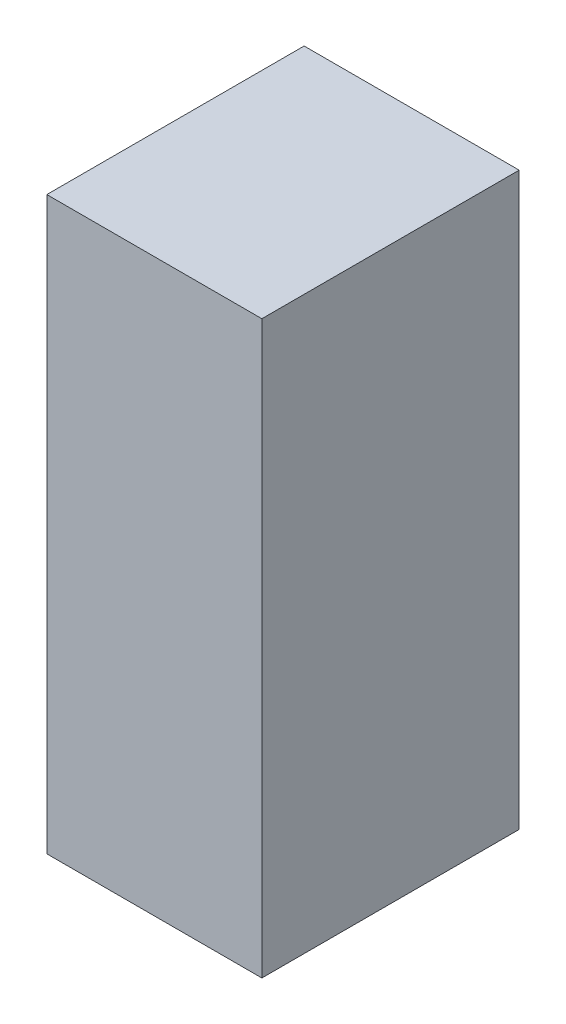
ISO-10303-21;
HEADER;
FILE_DESCRIPTION(('STEP AP214'),'2;1');
FILE_NAME('part.step','',(''),(''),'','','');
FILE_SCHEMA(('AUTOMOTIVE_DESIGN { 1 0 10303 214 1 1 1 1 }'));
ENDSEC;
DATA;
#1=APPLICATION_CONTEXT('core data for automotive mechanical design processes');
#2=APPLICATION_PROTOCOL_DEFINITION('international standard','automotive_design',2000,#1);
#3=PRODUCT_CONTEXT('',#1,'mechanical');
#4=PRODUCT('Part','Part','',(#3));
#5=PRODUCT_RELATED_PRODUCT_CATEGORY('part','',(#4));
#6=PRODUCT_DEFINITION_FORMATION('','',#4);
#7=PRODUCT_DEFINITION_CONTEXT('part definition',#1,'design');
#8=PRODUCT_DEFINITION('design','',#6,#7);
#9=PRODUCT_DEFINITION_SHAPE('','',#8);
#10=(LENGTH_UNIT() NAMED_UNIT(*) SI_UNIT(.MILLI.,.METRE.));
#11=(NAMED_UNIT(*) PLANE_ANGLE_UNIT() SI_UNIT($,.RADIAN.));
#12=(NAMED_UNIT(*) SI_UNIT($,.STERADIAN.) SOLID_ANGLE_UNIT());
#13=UNCERTAINTY_MEASURE_WITH_UNIT(LENGTH_MEASURE(1.E-05),#10,'distance_accuracy_value','');
#14=(GEOMETRIC_REPRESENTATION_CONTEXT(3) GLOBAL_UNCERTAINTY_ASSIGNED_CONTEXT((#13)) GLOBAL_UNIT_ASSIGNED_CONTEXT((#10,
#11,#12)) REPRESENTATION_CONTEXT('',''));
#15=CARTESIAN_POINT('',(0.,0.,0.));
#16=DIRECTION('',(0.,0.,1.));
#17=DIRECTION('',(1.,0.,0.));
#18=AXIS2_PLACEMENT_3D('',#15,#16,#17);
#19=CARTESIAN_POINT('',(0.,77.,0.));
#20=DIRECTION('',(1.,0.,0.));
#21=DIRECTION('',(0.,0.,-1.));
#22=AXIS2_PLACEMENT_3D('',#19,#20,#21);
#23=PLANE('',#22);
#24=DIRECTION('',(0.,0.,1.));
#25=VECTOR('',#24,1.);
#26=CARTESIAN_POINT('',(0.,0.,0.));
#27=LINE('',#26,#25);
#28=CARTESIAN_POINT('',(0.,0.,-34.7));
#29=VERTEX_POINT('',#28);
#30=CARTESIAN_POINT('',(0.,0.,0.));
#31=VERTEX_POINT('',#30);
#32=EDGE_CURVE('E96',#29,#31,#27,.T.);
#33=ORIENTED_EDGE('',*,*,#32,.T.);
#34=DIRECTION('',(0.,-1.,0.));
#35=VECTOR('',#34,1.);
#36=CARTESIAN_POINT('',(0.,77.,0.));
#37=LINE('',#36,#35);
#38=CARTESIAN_POINT('',(0.,77.,0.));
#39=VERTEX_POINT('',#38);
#40=EDGE_CURVE('E11',#39,#31,#37,.T.);
#41=ORIENTED_EDGE('',*,*,#40,.F.);
#42=DIRECTION('',(0.,0.,1.));
#43=VECTOR('',#42,1.);
#44=CARTESIAN_POINT('',(0.,77.,0.));
#45=LINE('',#44,#43);
#46=CARTESIAN_POINT('',(0.,77.,-34.7));
#47=VERTEX_POINT('',#46);
#48=EDGE_CURVE('E84',#47,#39,#45,.T.);
#49=ORIENTED_EDGE('',*,*,#48,.F.);
#50=DIRECTION('',(0.,-1.,0.));
#51=VECTOR('',#50,1.);
#52=CARTESIAN_POINT('',(0.,77.,-34.7));
#53=LINE('',#52,#51);
#54=EDGE_CURVE('E92',#47,#29,#53,.T.);
#55=ORIENTED_EDGE('',*,*,#54,.T.);
#56=EDGE_LOOP('',(#33,#41,#49,#55));
#57=FACE_BOUND('',#56,.T.);
#58=ADVANCED_FACE('F33',(#57),#23,.F.);
#59=CARTESIAN_POINT('',(0.,77.,0.));
#60=DIRECTION('',(0.,0.,-1.));
#61=DIRECTION('',(-1.,0.,0.));
#62=AXIS2_PLACEMENT_3D('',#59,#60,#61);
#63=PLANE('',#62);
#64=DIRECTION('',(1.,0.,0.));
#65=VECTOR('',#64,1.);
#66=CARTESIAN_POINT('',(0.,0.,0.));
#67=LINE('',#66,#65);
#68=CARTESIAN_POINT('',(29.,0.,0.));
#69=VERTEX_POINT('',#68);
#70=EDGE_CURVE('E88',#31,#69,#67,.T.);
#71=ORIENTED_EDGE('',*,*,#70,.T.);
#72=DIRECTION('',(0.,-1.,0.));
#73=VECTOR('',#72,1.);
#74=CARTESIAN_POINT('',(29.,77.,0.));
#75=LINE('',#74,#73);
#76=CARTESIAN_POINT('',(29.,77.,0.));
#77=VERTEX_POINT('',#76);
#78=EDGE_CURVE('E41',#77,#69,#75,.T.);
#79=ORIENTED_EDGE('',*,*,#78,.F.);
#80=DIRECTION('',(1.,0.,0.));
#81=VECTOR('',#80,1.);
#82=CARTESIAN_POINT('',(0.,77.,0.));
#83=LINE('',#82,#81);
#84=EDGE_CURVE('E79',#39,#77,#83,.T.);
#85=ORIENTED_EDGE('',*,*,#84,.F.);
#86=ORIENTED_EDGE('',*,*,#40,.T.);
#87=EDGE_LOOP('',(#71,#79,#85,#86));
#88=FACE_BOUND('',#87,.T.);
#89=ADVANCED_FACE('F87',(#88),#63,.F.);
#90=CARTESIAN_POINT('',(29.,77.,0.));
#91=DIRECTION('',(-1.,0.,0.));
#92=DIRECTION('',(0.,0.,1.));
#93=AXIS2_PLACEMENT_3D('',#90,#91,#92);
#94=PLANE('',#93);
#95=DIRECTION('',(0.,0.,-1.));
#96=VECTOR('',#95,1.);
#97=CARTESIAN_POINT('',(29.,0.,0.));
#98=LINE('',#97,#96);
#99=CARTESIAN_POINT('',(29.,0.,-34.7));
#100=VERTEX_POINT('',#99);
#101=EDGE_CURVE('E66',#69,#100,#98,.T.);
#102=ORIENTED_EDGE('',*,*,#101,.T.);
#103=DIRECTION('',(0.,-1.,0.));
#104=VECTOR('',#103,1.);
#105=CARTESIAN_POINT('',(29.,77.,-34.7));
#106=LINE('',#105,#104);
#107=CARTESIAN_POINT('',(29.,77.,-34.7));
#108=VERTEX_POINT('',#107);
#109=EDGE_CURVE('E89',#108,#100,#106,.T.);
#110=ORIENTED_EDGE('',*,*,#109,.F.);
#111=DIRECTION('',(0.,0.,-1.));
#112=VECTOR('',#111,1.);
#113=CARTESIAN_POINT('',(29.,77.,0.));
#114=LINE('',#113,#112);
#115=EDGE_CURVE('E82',#77,#108,#114,.T.);
#116=ORIENTED_EDGE('',*,*,#115,.F.);
#117=ORIENTED_EDGE('',*,*,#78,.T.);
#118=EDGE_LOOP('',(#102,#110,#116,#117));
#119=FACE_BOUND('',#118,.T.);
#120=ADVANCED_FACE('F90',(#119),#94,.F.);
#121=CARTESIAN_POINT('',(0.,77.,-34.7));
#122=DIRECTION('',(0.,0.,1.));
#123=DIRECTION('',(1.,0.,0.));
#124=AXIS2_PLACEMENT_3D('',#121,#122,#123);
#125=PLANE('',#124);
#126=DIRECTION('',(-1.,0.,0.));
#127=VECTOR('',#126,1.);
#128=CARTESIAN_POINT('',(0.,0.,-34.7));
#129=LINE('',#128,#127);
#130=EDGE_CURVE('E72',#100,#29,#129,.T.);
#131=ORIENTED_EDGE('',*,*,#130,.T.);
#132=ORIENTED_EDGE('',*,*,#54,.F.);
#133=DIRECTION('',(-1.,0.,0.));
#134=VECTOR('',#133,1.);
#135=CARTESIAN_POINT('',(0.,77.,-34.7));
#136=LINE('',#135,#134);
#137=EDGE_CURVE('E49',#108,#47,#136,.T.);
#138=ORIENTED_EDGE('',*,*,#137,.F.);
#139=ORIENTED_EDGE('',*,*,#109,.T.);
#140=EDGE_LOOP('',(#131,#132,#138,#139));
#141=FACE_BOUND('',#140,.T.);
#142=ADVANCED_FACE('F103',(#141),#125,.F.);
#143=CARTESIAN_POINT('',(0.,77.,0.));
#144=DIRECTION('',(0.,-1.,0.));
#145=DIRECTION('',(0.,0.,-1.));
#146=AXIS2_PLACEMENT_3D('',#143,#144,#145);
#147=PLANE('',#146);
#148=ORIENTED_EDGE('',*,*,#48,.T.);
#149=ORIENTED_EDGE('',*,*,#84,.T.);
#150=ORIENTED_EDGE('',*,*,#115,.T.);
#151=ORIENTED_EDGE('',*,*,#137,.T.);
#152=EDGE_LOOP('',(#148,#149,#150,#151));
#153=FACE_BOUND('',#152,.T.);
#154=ADVANCED_FACE('F80',(#153),#147,.F.);
#155=CARTESIAN_POINT('',(0.,0.,0.));
#156=DIRECTION('',(0.,-1.,0.));
#157=DIRECTION('',(0.,0.,-1.));
#158=AXIS2_PLACEMENT_3D('',#155,#156,#157);
#159=PLANE('',#158);
#160=ORIENTED_EDGE('',*,*,#32,.F.);
#161=ORIENTED_EDGE('',*,*,#130,.F.);
#162=ORIENTED_EDGE('',*,*,#101,.F.);
#163=ORIENTED_EDGE('',*,*,#70,.F.);
#164=EDGE_LOOP('',(#160,#161,#162,#163));
#165=FACE_BOUND('',#164,.T.);
#166=ADVANCED_FACE('F106',(#165),#159,.T.);
#167=CLOSED_SHELL('',(#58,#89,#120,#142,#154,#166));
#168=MANIFOLD_SOLID_BREP('B2',#167);
#169=ADVANCED_BREP_SHAPE_REPRESENTATION('',(#18,#168),#14);
#170=SHAPE_DEFINITION_REPRESENTATION(#9,#169);
ENDSEC;
END-ISO-10303-21;
